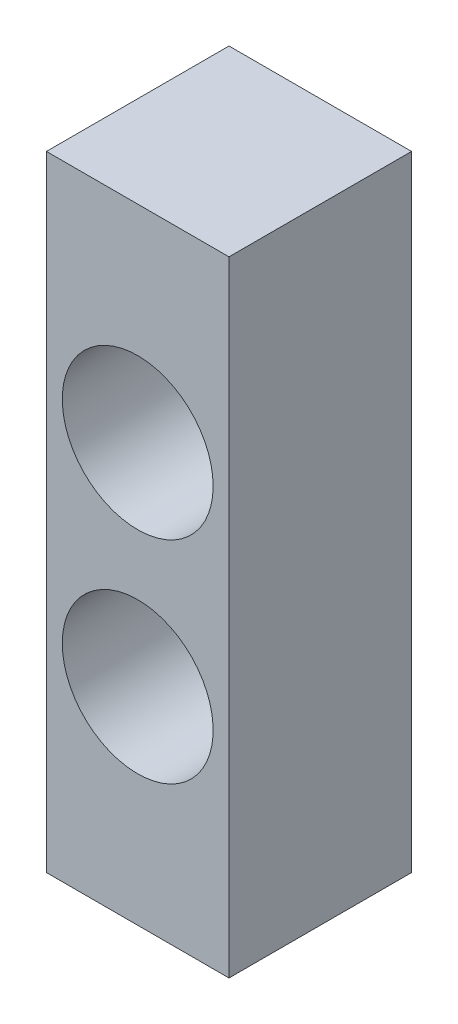
ISO-10303-21;
HEADER;
FILE_DESCRIPTION(('STEP AP214'),'2;1');
FILE_NAME('part.step','',(''),(''),'','','');
FILE_SCHEMA(('AUTOMOTIVE_DESIGN { 1 0 10303 214 1 1 1 1 }'));
ENDSEC;
DATA;
#1=APPLICATION_CONTEXT('core data for automotive mechanical design processes');
#2=APPLICATION_PROTOCOL_DEFINITION('international standard','automotive_design',2000,#1);
#3=PRODUCT_CONTEXT('',#1,'mechanical');
#4=PRODUCT('Part','Part','',(#3));
#5=PRODUCT_RELATED_PRODUCT_CATEGORY('part','',(#4));
#6=PRODUCT_DEFINITION_FORMATION('','',#4);
#7=PRODUCT_DEFINITION_CONTEXT('part definition',#1,'design');
#8=PRODUCT_DEFINITION('design','',#6,#7);
#9=PRODUCT_DEFINITION_SHAPE('','',#8);
#10=(LENGTH_UNIT() NAMED_UNIT(*) SI_UNIT(.MILLI.,.METRE.));
#11=(NAMED_UNIT(*) PLANE_ANGLE_UNIT() SI_UNIT($,.RADIAN.));
#12=(NAMED_UNIT(*) SI_UNIT($,.STERADIAN.) SOLID_ANGLE_UNIT());
#13=UNCERTAINTY_MEASURE_WITH_UNIT(LENGTH_MEASURE(1.E-05),#10,'distance_accuracy_value','');
#14=(GEOMETRIC_REPRESENTATION_CONTEXT(3) GLOBAL_UNCERTAINTY_ASSIGNED_CONTEXT((#13)) GLOBAL_UNIT_ASSIGNED_CONTEXT((#10,
#11,#12)) REPRESENTATION_CONTEXT('',''));
#15=CARTESIAN_POINT('',(0.,0.,0.));
#16=DIRECTION('',(0.,0.,1.));
#17=DIRECTION('',(1.,0.,0.));
#18=AXIS2_PLACEMENT_3D('',#15,#16,#17);
#19=CARTESIAN_POINT('',(-4.826,33.02,-4.826));
#20=DIRECTION('',(1.,0.,0.));
#21=DIRECTION('',(0.,0.,-1.));
#22=AXIS2_PLACEMENT_3D('',#19,#20,#21);
#23=PLANE('',#22);
#24=DIRECTION('',(0.,0.,1.));
#25=VECTOR('',#24,1.);
#26=CARTESIAN_POINT('',(-4.826,0.,-4.826));
#27=LINE('',#26,#25);
#28=CARTESIAN_POINT('',(-4.826,0.,-4.826));
#29=VERTEX_POINT('',#28);
#30=CARTESIAN_POINT('',(-4.826,0.,4.826));
#31=VERTEX_POINT('',#30);
#32=EDGE_CURVE('E95',#29,#31,#27,.T.);
#33=ORIENTED_EDGE('',*,*,#32,.T.);
#34=DIRECTION('',(0.,-1.,0.));
#35=VECTOR('',#34,1.);
#36=CARTESIAN_POINT('',(-4.826,33.02,4.826));
#37=LINE('',#36,#35);
#38=CARTESIAN_POINT('',(-4.826,33.02,4.826));
#39=VERTEX_POINT('',#38);
#40=EDGE_CURVE('E11',#39,#31,#37,.T.);
#41=ORIENTED_EDGE('',*,*,#40,.F.);
#42=DIRECTION('',(0.,0.,1.));
#43=VECTOR('',#42,1.);
#44=CARTESIAN_POINT('',(-4.826,33.02,-4.826));
#45=LINE('',#44,#43);
#46=CARTESIAN_POINT('',(-4.826,33.02,-4.826));
#47=VERTEX_POINT('',#46);
#48=EDGE_CURVE('E83',#47,#39,#45,.T.);
#49=ORIENTED_EDGE('',*,*,#48,.F.);
#50=DIRECTION('',(0.,-1.,0.));
#51=VECTOR('',#50,1.);
#52=CARTESIAN_POINT('',(-4.826,33.02,-4.826));
#53=LINE('',#52,#51);
#54=EDGE_CURVE('E91',#47,#29,#53,.T.);
#55=ORIENTED_EDGE('',*,*,#54,.T.);
#56=EDGE_LOOP('',(#33,#41,#49,#55));
#57=FACE_BOUND('',#56,.T.);
#58=ADVANCED_FACE('F32',(#57),#23,.F.);
#59=CARTESIAN_POINT('',(-4.826,33.02,4.826));
#60=DIRECTION('',(0.,0.,-1.));
#61=DIRECTION('',(-1.,0.,0.));
#62=AXIS2_PLACEMENT_3D('',#59,#60,#61);
#63=PLANE('',#62);
#64=CARTESIAN_POINT('',(0.,10.922,4.826));
#65=DIRECTION('',(0.,0.,1.));
#66=DIRECTION('',(-1.,0.,0.));
#67=AXIS2_PLACEMENT_3D('',#64,#65,#66);
#68=CIRCLE('',#67,3.9878);
#69=CARTESIAN_POINT('',(-3.9878,10.922,4.826));
#70=VERTEX_POINT('',#69);
#71=EDGE_CURVE('E115',#70,#70,#68,.T.);
#72=ORIENTED_EDGE('',*,*,#71,.F.);
#73=EDGE_LOOP('',(#72));
#74=FACE_BOUND('',#73,.T.);
#75=CARTESIAN_POINT('',(0.,22.098,4.826));
#76=DIRECTION('',(0.,0.,1.));
#77=DIRECTION('',(1.,0.,0.));
#78=AXIS2_PLACEMENT_3D('',#75,#76,#77);
#79=CIRCLE('',#78,3.9878);
#80=CARTESIAN_POINT('',(3.9878,22.098,4.826));
#81=VERTEX_POINT('',#80);
#82=EDGE_CURVE('E109',#81,#81,#79,.T.);
#83=ORIENTED_EDGE('',*,*,#82,.F.);
#84=EDGE_LOOP('',(#83));
#85=FACE_BOUND('',#84,.T.);
#86=DIRECTION('',(1.,0.,0.));
#87=VECTOR('',#86,1.);
#88=CARTESIAN_POINT('',(-4.826,0.,4.826));
#89=LINE('',#88,#87);
#90=CARTESIAN_POINT('',(4.826,0.,4.826));
#91=VERTEX_POINT('',#90);
#92=EDGE_CURVE('E87',#31,#91,#89,.T.);
#93=ORIENTED_EDGE('',*,*,#92,.T.);
#94=DIRECTION('',(0.,-1.,0.));
#95=VECTOR('',#94,1.);
#96=CARTESIAN_POINT('',(4.826,33.02,4.826));
#97=LINE('',#96,#95);
#98=CARTESIAN_POINT('',(4.826,33.02,4.826));
#99=VERTEX_POINT('',#98);
#100=EDGE_CURVE('E40',#99,#91,#97,.T.);
#101=ORIENTED_EDGE('',*,*,#100,.F.);
#102=DIRECTION('',(1.,0.,0.));
#103=VECTOR('',#102,1.);
#104=CARTESIAN_POINT('',(-4.826,33.02,4.826));
#105=LINE('',#104,#103);
#106=EDGE_CURVE('E78',#39,#99,#105,.T.);
#107=ORIENTED_EDGE('',*,*,#106,.F.);
#108=ORIENTED_EDGE('',*,*,#40,.T.);
#109=EDGE_LOOP('',(#93,#101,#107,#108));
#110=FACE_BOUND('',#109,.T.);
#111=ADVANCED_FACE('F86',(#74,#85,#110),#63,.F.);
#112=CARTESIAN_POINT('',(4.826,33.02,-4.826));
#113=DIRECTION('',(-1.,0.,0.));
#114=DIRECTION('',(0.,0.,1.));
#115=AXIS2_PLACEMENT_3D('',#112,#113,#114);
#116=PLANE('',#115);
#117=DIRECTION('',(0.,0.,-1.));
#118=VECTOR('',#117,1.);
#119=CARTESIAN_POINT('',(4.826,0.,-4.826));
#120=LINE('',#119,#118);
#121=CARTESIAN_POINT('',(4.826,0.,-4.826));
#122=VERTEX_POINT('',#121);
#123=EDGE_CURVE('E65',#91,#122,#120,.T.);
#124=ORIENTED_EDGE('',*,*,#123,.T.);
#125=DIRECTION('',(0.,-1.,0.));
#126=VECTOR('',#125,1.);
#127=CARTESIAN_POINT('',(4.826,33.02,-4.826));
#128=LINE('',#127,#126);
#129=CARTESIAN_POINT('',(4.826,33.02,-4.826));
#130=VERTEX_POINT('',#129);
#131=EDGE_CURVE('E88',#130,#122,#128,.T.);
#132=ORIENTED_EDGE('',*,*,#131,.F.);
#133=DIRECTION('',(0.,0.,-1.));
#134=VECTOR('',#133,1.);
#135=CARTESIAN_POINT('',(4.826,33.02,-4.826));
#136=LINE('',#135,#134);
#137=EDGE_CURVE('E81',#99,#130,#136,.T.);
#138=ORIENTED_EDGE('',*,*,#137,.F.);
#139=ORIENTED_EDGE('',*,*,#100,.T.);
#140=EDGE_LOOP('',(#124,#132,#138,#139));
#141=FACE_BOUND('',#140,.T.);
#142=ADVANCED_FACE('F89',(#141),#116,.F.);
#143=CARTESIAN_POINT('',(-4.826,33.02,-4.826));
#144=DIRECTION('',(0.,0.,1.));
#145=DIRECTION('',(1.,0.,0.));
#146=AXIS2_PLACEMENT_3D('',#143,#144,#145);
#147=PLANE('',#146);
#148=CARTESIAN_POINT('',(0.,10.922,-4.826));
#149=DIRECTION('',(0.,0.,1.));
#150=DIRECTION('',(-1.,0.,0.));
#151=AXIS2_PLACEMENT_3D('',#148,#149,#150);
#152=CIRCLE('',#151,3.9878);
#153=CARTESIAN_POINT('',(-3.9878,10.922,-4.826));
#154=VERTEX_POINT('',#153);
#155=EDGE_CURVE('E112',#154,#154,#152,.T.);
#156=ORIENTED_EDGE('',*,*,#155,.T.);
#157=EDGE_LOOP('',(#156));
#158=FACE_BOUND('',#157,.T.);
#159=CARTESIAN_POINT('',(0.,22.098,-4.826));
#160=DIRECTION('',(0.,0.,1.));
#161=DIRECTION('',(1.,0.,0.));
#162=AXIS2_PLACEMENT_3D('',#159,#160,#161);
#163=CIRCLE('',#162,3.9878);
#164=CARTESIAN_POINT('',(3.9878,22.098,-4.826));
#165=VERTEX_POINT('',#164);
#166=EDGE_CURVE('E98',#165,#165,#163,.T.);
#167=ORIENTED_EDGE('',*,*,#166,.T.);
#168=EDGE_LOOP('',(#167));
#169=FACE_BOUND('',#168,.T.);
#170=DIRECTION('',(-1.,0.,0.));
#171=VECTOR('',#170,1.);
#172=CARTESIAN_POINT('',(-4.826,0.,-4.826));
#173=LINE('',#172,#171);
#174=EDGE_CURVE('E71',#122,#29,#173,.T.);
#175=ORIENTED_EDGE('',*,*,#174,.T.);
#176=ORIENTED_EDGE('',*,*,#54,.F.);
#177=DIRECTION('',(-1.,0.,0.));
#178=VECTOR('',#177,1.);
#179=CARTESIAN_POINT('',(-4.826,33.02,-4.826));
#180=LINE('',#179,#178);
#181=EDGE_CURVE('E48',#130,#47,#180,.T.);
#182=ORIENTED_EDGE('',*,*,#181,.F.);
#183=ORIENTED_EDGE('',*,*,#131,.T.);
#184=EDGE_LOOP('',(#175,#176,#182,#183));
#185=FACE_BOUND('',#184,.T.);
#186=ADVANCED_FACE('F103',(#158,#169,#185),#147,.F.);
#187=CARTESIAN_POINT('',(-4.826,33.02,4.826));
#188=DIRECTION('',(0.,1.,0.));
#189=DIRECTION('',(0.,0.,1.));
#190=AXIS2_PLACEMENT_3D('',#187,#188,#189);
#191=PLANE('',#190);
#192=ORIENTED_EDGE('',*,*,#48,.T.);
#193=ORIENTED_EDGE('',*,*,#106,.T.);
#194=ORIENTED_EDGE('',*,*,#137,.T.);
#195=ORIENTED_EDGE('',*,*,#181,.T.);
#196=EDGE_LOOP('',(#192,#193,#194,#195));
#197=FACE_BOUND('',#196,.T.);
#198=ADVANCED_FACE('F79',(#197),#191,.T.);
#199=CARTESIAN_POINT('',(-4.826,0.,4.826));
#200=DIRECTION('',(0.,1.,0.));
#201=DIRECTION('',(0.,0.,1.));
#202=AXIS2_PLACEMENT_3D('',#199,#200,#201);
#203=PLANE('',#202);
#204=ORIENTED_EDGE('',*,*,#32,.F.);
#205=ORIENTED_EDGE('',*,*,#174,.F.);
#206=ORIENTED_EDGE('',*,*,#123,.F.);
#207=ORIENTED_EDGE('',*,*,#92,.F.);
#208=EDGE_LOOP('',(#204,#205,#206,#207));
#209=FACE_BOUND('',#208,.T.);
#210=ADVANCED_FACE('F106',(#209),#203,.F.);
#211=CARTESIAN_POINT('',(0.,22.098,-4.826));
#212=DIRECTION('',(0.,0.,1.));
#213=DIRECTION('',(1.,0.,0.));
#214=AXIS2_PLACEMENT_3D('',#211,#212,#213);
#215=CYLINDRICAL_SURFACE('',#214,3.9878);
#216=ORIENTED_EDGE('',*,*,#166,.F.);
#217=EDGE_LOOP('',(#216));
#218=FACE_BOUND('',#217,.T.);
#219=ORIENTED_EDGE('',*,*,#82,.T.);
#220=EDGE_LOOP('',(#219));
#221=FACE_BOUND('',#220,.T.);
#222=ADVANCED_FACE('F126',(#218,#221),#215,.F.);
#223=CARTESIAN_POINT('',(0.,10.922,-4.826));
#224=DIRECTION('',(0.,0.,1.));
#225=DIRECTION('',(1.,0.,0.));
#226=AXIS2_PLACEMENT_3D('',#223,#224,#225);
#227=CYLINDRICAL_SURFACE('',#226,3.9878);
#228=ORIENTED_EDGE('',*,*,#155,.F.);
#229=EDGE_LOOP('',(#228));
#230=FACE_BOUND('',#229,.T.);
#231=ORIENTED_EDGE('',*,*,#71,.T.);
#232=EDGE_LOOP('',(#231));
#233=FACE_BOUND('',#232,.T.);
#234=ADVANCED_FACE('F123',(#230,#233),#227,.F.);
#235=CLOSED_SHELL('',(#58,#111,#142,#186,#198,#210,#222,#234));
#236=MANIFOLD_SOLID_BREP('B2',#235);
#237=ADVANCED_BREP_SHAPE_REPRESENTATION('',(#18,#236),#14);
#238=SHAPE_DEFINITION_REPRESENTATION(#9,#237);
ENDSEC;
END-ISO-10303-21;
